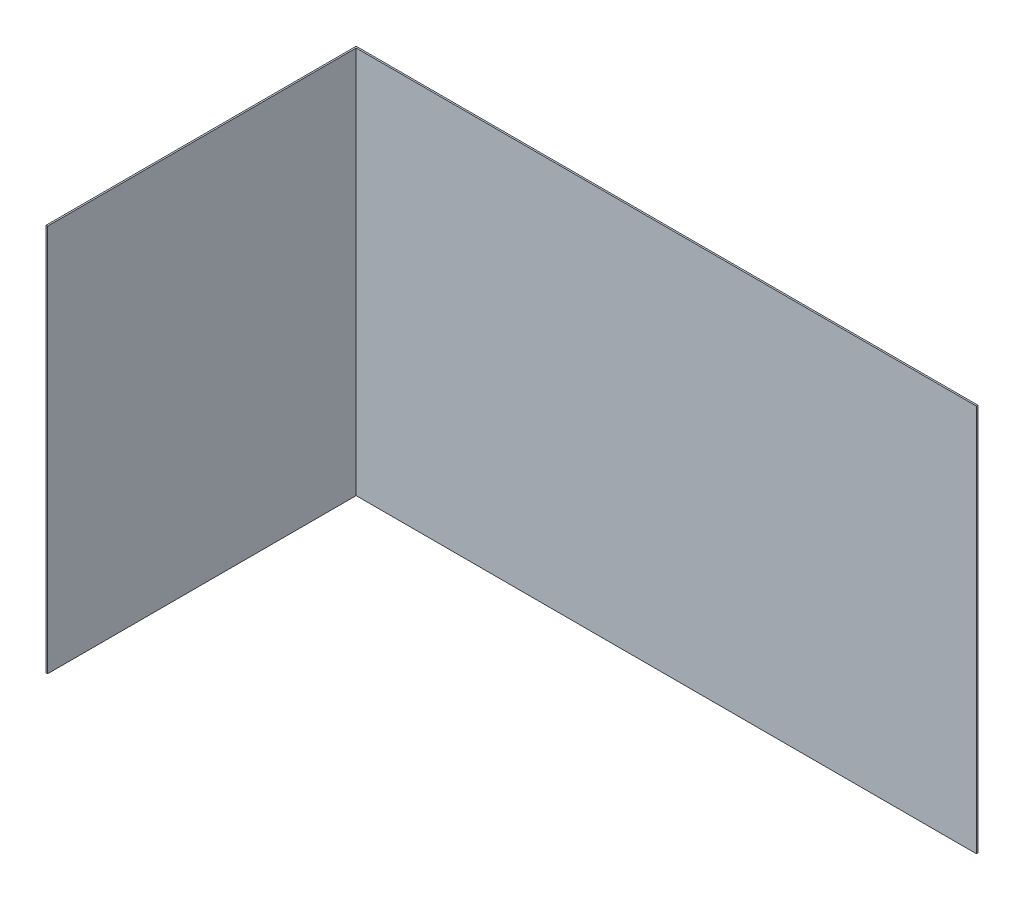
ISO-10303-21;
HEADER;
FILE_DESCRIPTION(('STEP AP214'),'2;1');
FILE_NAME('part.step','',(''),(''),'','','');
FILE_SCHEMA(('AUTOMOTIVE_DESIGN { 1 0 10303 214 1 1 1 1 }'));
ENDSEC;
DATA;
#1=APPLICATION_CONTEXT('core data for automotive mechanical design processes');
#2=APPLICATION_PROTOCOL_DEFINITION('international standard','automotive_design',2000,#1);
#3=PRODUCT_CONTEXT('',#1,'mechanical');
#4=PRODUCT('Part','Part','',(#3));
#5=PRODUCT_RELATED_PRODUCT_CATEGORY('part','',(#4));
#6=PRODUCT_DEFINITION_FORMATION('','',#4);
#7=PRODUCT_DEFINITION_CONTEXT('part definition',#1,'design');
#8=PRODUCT_DEFINITION('design','',#6,#7);
#9=PRODUCT_DEFINITION_SHAPE('','',#8);
#10=(LENGTH_UNIT() NAMED_UNIT(*) SI_UNIT(.MILLI.,.METRE.));
#11=(NAMED_UNIT(*) PLANE_ANGLE_UNIT() SI_UNIT($,.RADIAN.));
#12=(NAMED_UNIT(*) SI_UNIT($,.STERADIAN.) SOLID_ANGLE_UNIT());
#13=UNCERTAINTY_MEASURE_WITH_UNIT(LENGTH_MEASURE(1.E-05),#10,'distance_accuracy_value','');
#14=(GEOMETRIC_REPRESENTATION_CONTEXT(3) GLOBAL_UNCERTAINTY_ASSIGNED_CONTEXT((#13)) GLOBAL_UNIT_ASSIGNED_CONTEXT((#10,
#11,#12)) REPRESENTATION_CONTEXT('',''));
#15=CARTESIAN_POINT('',(0.,0.,0.));
#16=DIRECTION('',(0.,0.,1.));
#17=DIRECTION('',(1.,0.,0.));
#18=AXIS2_PLACEMENT_3D('',#15,#16,#17);
#19=CARTESIAN_POINT('',(0.,0.,0.2));
#20=DIRECTION('',(0.,0.,-1.));
#21=DIRECTION('',(-1.,0.,0.));
#22=AXIS2_PLACEMENT_3D('',#19,#20,#21);
#23=PLANE('',#22);
#24=DIRECTION('',(-1.,0.,0.));
#25=VECTOR('',#24,1.);
#26=CARTESIAN_POINT('',(0.,0.25,0.2));
#27=LINE('',#26,#25);
#28=CARTESIAN_POINT('',(0.,0.25,0.2));
#29=VERTEX_POINT('',#28);
#30=CARTESIAN_POINT('',(-0.00100000000000002,0.25,0.2));
#31=VERTEX_POINT('',#30);
#32=EDGE_CURVE('E88',#29,#31,#27,.T.);
#33=ORIENTED_EDGE('',*,*,#32,.T.);
#34=DIRECTION('',(0.,1.,0.));
#35=VECTOR('',#34,1.);
#36=CARTESIAN_POINT('',(-0.00100000000000004,0.,0.2));
#37=LINE('',#36,#35);
#38=CARTESIAN_POINT('',(-0.00100000000000004,0.,0.2));
#39=VERTEX_POINT('',#38);
#40=EDGE_CURVE('E72',#31,#39,#37,.F.);
#41=ORIENTED_EDGE('',*,*,#40,.T.);
#42=DIRECTION('',(-1.,0.,0.));
#43=VECTOR('',#42,1.);
#44=CARTESIAN_POINT('',(0.,0.,0.2));
#45=LINE('',#44,#43);
#46=CARTESIAN_POINT('',(0.,0.,0.2));
#47=VERTEX_POINT('',#46);
#48=EDGE_CURVE('E20',#39,#47,#45,.F.);
#49=ORIENTED_EDGE('',*,*,#48,.T.);
#50=DIRECTION('',(0.,1.,0.));
#51=VECTOR('',#50,1.);
#52=CARTESIAN_POINT('',(0.,0.,0.2));
#53=LINE('',#52,#51);
#54=EDGE_CURVE('E77',#29,#47,#53,.F.);
#55=ORIENTED_EDGE('',*,*,#54,.F.);
#56=EDGE_LOOP('',(#33,#41,#49,#55));
#57=FACE_BOUND('',#56,.T.);
#58=ADVANCED_FACE('F17',(#57),#23,.F.);
#59=CARTESIAN_POINT('',(0.,0.,0.));
#60=DIRECTION('',(1.,0.,0.));
#61=DIRECTION('',(0.,0.,-1.));
#62=AXIS2_PLACEMENT_3D('',#59,#60,#61);
#63=PLANE('',#62);
#64=DIRECTION('',(0.,0.,-1.));
#65=VECTOR('',#64,1.);
#66=CARTESIAN_POINT('',(0.,0.25,0.));
#67=LINE('',#66,#65);
#68=CARTESIAN_POINT('',(0.,0.25,0.000999999999999999));
#69=VERTEX_POINT('',#68);
#70=EDGE_CURVE('E111',#69,#29,#67,.F.);
#71=ORIENTED_EDGE('',*,*,#70,.T.);
#72=ORIENTED_EDGE('',*,*,#54,.T.);
#73=DIRECTION('',(0.,0.,-1.));
#74=VECTOR('',#73,1.);
#75=CARTESIAN_POINT('',(0.,0.,0.));
#76=LINE('',#75,#74);
#77=CARTESIAN_POINT('',(0.,0.,0.001));
#78=VERTEX_POINT('',#77);
#79=EDGE_CURVE('E83',#47,#78,#76,.T.);
#80=ORIENTED_EDGE('',*,*,#79,.T.);
#81=DIRECTION('',(0.,1.,0.));
#82=VECTOR('',#81,1.);
#83=CARTESIAN_POINT('',(0.,0.,0.001));
#84=LINE('',#83,#82);
#85=EDGE_CURVE('E100',#78,#69,#84,.T.);
#86=ORIENTED_EDGE('',*,*,#85,.T.);
#87=EDGE_LOOP('',(#71,#72,#80,#86));
#88=FACE_BOUND('',#87,.T.);
#89=ADVANCED_FACE('F112',(#88),#63,.T.);
#90=CARTESIAN_POINT('',(-0.001,0.25,0.));
#91=DIRECTION('',(1.,0.,0.));
#92=DIRECTION('',(0.,0.,-1.));
#93=AXIS2_PLACEMENT_3D('',#90,#91,#92);
#94=PLANE('',#93);
#95=DIRECTION('',(0.,0.,1.));
#96=VECTOR('',#95,1.);
#97=CARTESIAN_POINT('',(-0.001,0.,0.));
#98=LINE('',#97,#96);
#99=CARTESIAN_POINT('',(-0.001,0.,0.));
#100=VERTEX_POINT('',#99);
#101=EDGE_CURVE('E67',#39,#100,#98,.F.);
#102=ORIENTED_EDGE('',*,*,#101,.F.);
#103=ORIENTED_EDGE('',*,*,#40,.F.);
#104=DIRECTION('',(0.,0.,-1.));
#105=VECTOR('',#104,1.);
#106=CARTESIAN_POINT('',(-0.001,0.25,0.));
#107=LINE('',#106,#105);
#108=CARTESIAN_POINT('',(-0.001,0.25,0.));
#109=VERTEX_POINT('',#108);
#110=EDGE_CURVE('E76',#31,#109,#107,.T.);
#111=ORIENTED_EDGE('',*,*,#110,.T.);
#112=DIRECTION('',(0.,1.,0.));
#113=VECTOR('',#112,1.);
#114=CARTESIAN_POINT('',(-0.001,0.,0.));
#115=LINE('',#114,#113);
#116=EDGE_CURVE('E74',#100,#109,#115,.T.);
#117=ORIENTED_EDGE('',*,*,#116,.F.);
#118=EDGE_LOOP('',(#102,#103,#111,#117));
#119=FACE_BOUND('',#118,.T.);
#120=ADVANCED_FACE('F69',(#119),#94,.F.);
#121=CARTESIAN_POINT('',(-0.001,0.,0.001));
#122=DIRECTION('',(0.,0.,-1.));
#123=DIRECTION('',(-1.,0.,0.));
#124=AXIS2_PLACEMENT_3D('',#121,#122,#123);
#125=PLANE('',#124);
#126=DIRECTION('',(1.,0.,0.));
#127=VECTOR('',#126,1.);
#128=CARTESIAN_POINT('',(0.4,0.25,0.001));
#129=LINE('',#128,#127);
#130=CARTESIAN_POINT('',(0.4,0.25,0.001));
#131=VERTEX_POINT('',#130);
#132=EDGE_CURVE('E99',#131,#69,#129,.F.);
#133=ORIENTED_EDGE('',*,*,#132,.T.);
#134=ORIENTED_EDGE('',*,*,#85,.F.);
#135=DIRECTION('',(1.,0.,0.));
#136=VECTOR('',#135,1.);
#137=CARTESIAN_POINT('',(-0.001,0.,0.001));
#138=LINE('',#137,#136);
#139=CARTESIAN_POINT('',(0.4,0.,0.001));
#140=VERTEX_POINT('',#139);
#141=EDGE_CURVE('E102',#78,#140,#138,.T.);
#142=ORIENTED_EDGE('',*,*,#141,.T.);
#143=DIRECTION('',(0.,1.,0.));
#144=VECTOR('',#143,1.);
#145=CARTESIAN_POINT('',(0.4,0.,0.001));
#146=LINE('',#145,#144);
#147=EDGE_CURVE('E95',#140,#131,#146,.T.);
#148=ORIENTED_EDGE('',*,*,#147,.T.);
#149=EDGE_LOOP('',(#133,#134,#142,#148));
#150=FACE_BOUND('',#149,.T.);
#151=ADVANCED_FACE('F114',(#150),#125,.F.);
#152=CARTESIAN_POINT('',(-0.001,0.,0.));
#153=DIRECTION('',(0.,1.,0.));
#154=DIRECTION('',(0.,0.,1.));
#155=AXIS2_PLACEMENT_3D('',#152,#153,#154);
#156=PLANE('',#155);
#157=ORIENTED_EDGE('',*,*,#141,.F.);
#158=ORIENTED_EDGE('',*,*,#79,.F.);
#159=ORIENTED_EDGE('',*,*,#48,.F.);
#160=ORIENTED_EDGE('',*,*,#101,.T.);
#161=DIRECTION('',(-1.,0.,0.));
#162=VECTOR('',#161,1.);
#163=CARTESIAN_POINT('',(-0.001,0.,0.));
#164=LINE('',#163,#162);
#165=CARTESIAN_POINT('',(0.4,0.,0.));
#166=VERTEX_POINT('',#165);
#167=EDGE_CURVE('E94',#166,#100,#164,.T.);
#168=ORIENTED_EDGE('',*,*,#167,.F.);
#169=DIRECTION('',(0.,0.,1.));
#170=VECTOR('',#169,1.);
#171=CARTESIAN_POINT('',(0.4,0.,0.));
#172=LINE('',#171,#170);
#173=EDGE_CURVE('E96',#166,#140,#172,.T.);
#174=ORIENTED_EDGE('',*,*,#173,.T.);
#175=EDGE_LOOP('',(#157,#158,#159,#160,#168,#174));
#176=FACE_BOUND('',#175,.T.);
#177=ADVANCED_FACE('F82',(#176),#156,.F.);
#178=CARTESIAN_POINT('',(0.4,0.25,0.));
#179=DIRECTION('',(0.,-1.,0.));
#180=DIRECTION('',(0.,0.,-1.));
#181=AXIS2_PLACEMENT_3D('',#178,#179,#180);
#182=PLANE('',#181);
#183=ORIENTED_EDGE('',*,*,#132,.F.);
#184=DIRECTION('',(0.,0.,-1.));
#185=VECTOR('',#184,1.);
#186=CARTESIAN_POINT('',(0.4,0.25,0.));
#187=LINE('',#186,#185);
#188=CARTESIAN_POINT('',(0.4,0.25,0.));
#189=VERTEX_POINT('',#188);
#190=EDGE_CURVE('E35',#131,#189,#187,.T.);
#191=ORIENTED_EDGE('',*,*,#190,.T.);
#192=DIRECTION('',(-1.,0.,0.));
#193=VECTOR('',#192,1.);
#194=CARTESIAN_POINT('',(-0.001,0.25,0.));
#195=LINE('',#194,#193);
#196=EDGE_CURVE('E26',#109,#189,#195,.F.);
#197=ORIENTED_EDGE('',*,*,#196,.F.);
#198=ORIENTED_EDGE('',*,*,#110,.F.);
#199=ORIENTED_EDGE('',*,*,#32,.F.);
#200=ORIENTED_EDGE('',*,*,#70,.F.);
#201=EDGE_LOOP('',(#183,#191,#197,#198,#199,#200));
#202=FACE_BOUND('',#201,.T.);
#203=ADVANCED_FACE('F127',(#202),#182,.F.);
#204=CARTESIAN_POINT('',(0.4,0.,0.));
#205=DIRECTION('',(-1.,0.,0.));
#206=DIRECTION('',(0.,0.,1.));
#207=AXIS2_PLACEMENT_3D('',#204,#205,#206);
#208=PLANE('',#207);
#209=ORIENTED_EDGE('',*,*,#190,.F.);
#210=ORIENTED_EDGE('',*,*,#147,.F.);
#211=ORIENTED_EDGE('',*,*,#173,.F.);
#212=DIRECTION('',(0.,1.,0.));
#213=VECTOR('',#212,1.);
#214=CARTESIAN_POINT('',(0.4,0.,0.));
#215=LINE('',#214,#213);
#216=EDGE_CURVE('E11',#189,#166,#215,.F.);
#217=ORIENTED_EDGE('',*,*,#216,.F.);
#218=EDGE_LOOP('',(#209,#210,#211,#217));
#219=FACE_BOUND('',#218,.T.);
#220=ADVANCED_FACE('F119',(#219),#208,.F.);
#221=CARTESIAN_POINT('',(-0.001,0.,0.));
#222=DIRECTION('',(0.,0.,-1.));
#223=DIRECTION('',(-1.,0.,0.));
#224=AXIS2_PLACEMENT_3D('',#221,#222,#223);
#225=PLANE('',#224);
#226=ORIENTED_EDGE('',*,*,#196,.T.);
#227=ORIENTED_EDGE('',*,*,#216,.T.);
#228=ORIENTED_EDGE('',*,*,#167,.T.);
#229=ORIENTED_EDGE('',*,*,#116,.T.);
#230=EDGE_LOOP('',(#226,#227,#228,#229));
#231=FACE_BOUND('',#230,.T.);
#232=ADVANCED_FACE('F126',(#231),#225,.T.);
#233=CLOSED_SHELL('',(#58,#89,#120,#151,#177,#203,#220,#232));
#234=MANIFOLD_SOLID_BREP('B1',#233);
#235=ADVANCED_BREP_SHAPE_REPRESENTATION('',(#18,#234),#14);
#236=SHAPE_DEFINITION_REPRESENTATION(#9,#235);
ENDSEC;
END-ISO-10303-21;
